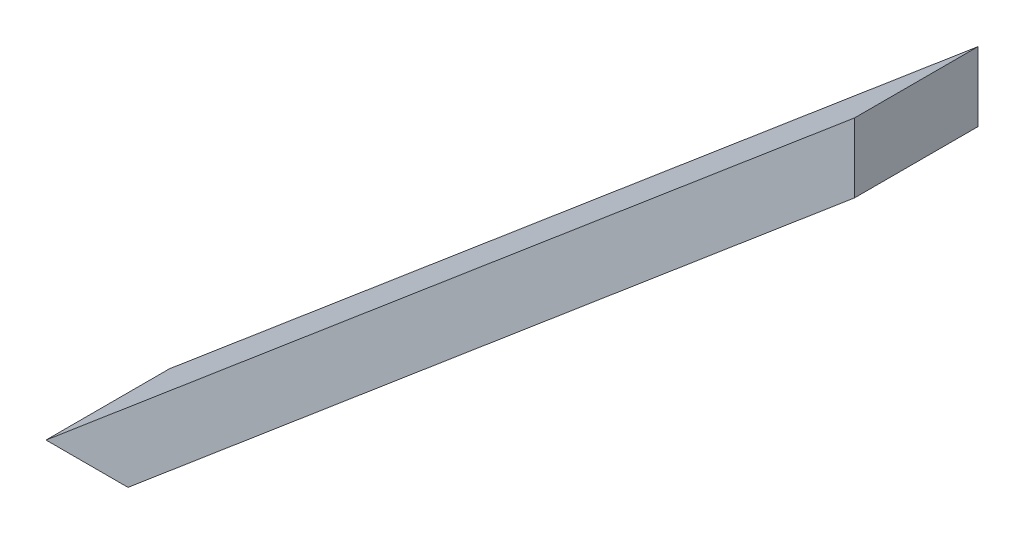
ISO-10303-21;
HEADER;
FILE_DESCRIPTION(('STEP AP214'),'2;1');
FILE_NAME('part.step','',(''),(''),'','','');
FILE_SCHEMA(('AUTOMOTIVE_DESIGN { 1 0 10303 214 1 1 1 1 }'));
ENDSEC;
DATA;
#1=APPLICATION_CONTEXT('core data for automotive mechanical design processes');
#2=APPLICATION_PROTOCOL_DEFINITION('international standard','automotive_design',2000,#1);
#3=PRODUCT_CONTEXT('',#1,'mechanical');
#4=PRODUCT('Part','Part','',(#3));
#5=PRODUCT_RELATED_PRODUCT_CATEGORY('part','',(#4));
#6=PRODUCT_DEFINITION_FORMATION('','',#4);
#7=PRODUCT_DEFINITION_CONTEXT('part definition',#1,'design');
#8=PRODUCT_DEFINITION('design','',#6,#7);
#9=PRODUCT_DEFINITION_SHAPE('','',#8);
#10=(LENGTH_UNIT() NAMED_UNIT(*) SI_UNIT(.MILLI.,.METRE.));
#11=(NAMED_UNIT(*) PLANE_ANGLE_UNIT() SI_UNIT($,.RADIAN.));
#12=(NAMED_UNIT(*) SI_UNIT($,.STERADIAN.) SOLID_ANGLE_UNIT());
#13=UNCERTAINTY_MEASURE_WITH_UNIT(LENGTH_MEASURE(1.E-05),#10,'distance_accuracy_value','');
#14=(GEOMETRIC_REPRESENTATION_CONTEXT(3) GLOBAL_UNCERTAINTY_ASSIGNED_CONTEXT((#13)) GLOBAL_UNIT_ASSIGNED_CONTEXT((#10,
#11,#12)) REPRESENTATION_CONTEXT('',''));
#15=CARTESIAN_POINT('',(0.,0.,0.));
#16=DIRECTION('',(0.,0.,1.));
#17=DIRECTION('',(1.,0.,0.));
#18=AXIS2_PLACEMENT_3D('',#15,#16,#17);
#19=CARTESIAN_POINT('',(-996.665165798843,-402.92894929732,44.45));
#20=DIRECTION('',(0.645444815350814,-0.763806906447404,0.));
#21=DIRECTION('',(0.763806906447405,0.645444815350814,0.));
#22=AXIS2_PLACEMENT_3D('',#19,#20,#21);
#23=PLANE('',#22);
#24=DIRECTION('',(-0.763806906447404,-0.645444815350814,0.));
#25=VECTOR('',#24,1.);
#26=CARTESIAN_POINT('',(-996.665165798843,-402.92894929732,-44.45));
#27=LINE('',#26,#25);
#28=CARTESIAN_POINT('',(-414.644303085921,88.9,-44.45));
#29=VERTEX_POINT('',#28);
#30=CARTESIAN_POINT('',(-996.665165798843,-402.92894929732,-44.45));
#31=VERTEX_POINT('',#30);
#32=EDGE_CURVE('E98',#29,#31,#27,.T.);
#33=ORIENTED_EDGE('',*,*,#32,.T.);
#34=DIRECTION('',(0.,0.,-1.));
#35=VECTOR('',#34,1.);
#36=CARTESIAN_POINT('',(-996.665165798843,-402.92894929732,44.45));
#37=LINE('',#36,#35);
#38=CARTESIAN_POINT('',(-996.665165798843,-402.92894929732,44.45));
#39=VERTEX_POINT('',#38);
#40=EDGE_CURVE('E11',#39,#31,#37,.T.);
#41=ORIENTED_EDGE('',*,*,#40,.F.);
#42=DIRECTION('',(-0.763806906447404,-0.645444815350814,0.));
#43=VECTOR('',#42,1.);
#44=CARTESIAN_POINT('',(-996.665165798843,-402.92894929732,44.45));
#45=LINE('',#44,#43);
#46=CARTESIAN_POINT('',(-414.644303085921,88.9,44.45));
#47=VERTEX_POINT('',#46);
#48=EDGE_CURVE('E86',#47,#39,#45,.T.);
#49=ORIENTED_EDGE('',*,*,#48,.F.);
#50=DIRECTION('',(0.,0.,-1.));
#51=VECTOR('',#50,1.);
#52=CARTESIAN_POINT('',(-414.644303085921,88.9,44.45));
#53=LINE('',#52,#51);
#54=EDGE_CURVE('E94',#47,#29,#53,.T.);
#55=ORIENTED_EDGE('',*,*,#54,.T.);
#56=EDGE_LOOP('',(#33,#41,#49,#55));
#57=FACE_BOUND('',#56,.T.);
#58=ADVANCED_FACE('F35',(#57),#23,.F.);
#59=CARTESIAN_POINT('',(-937.636106932995,-402.92894929732,44.45));
#60=DIRECTION('',(0.,1.,0.));
#61=DIRECTION('',(-1.,0.,0.));
#62=AXIS2_PLACEMENT_3D('',#59,#60,#61);
#63=PLANE('',#62);
#64=DIRECTION('',(1.,0.,0.));
#65=VECTOR('',#64,1.);
#66=CARTESIAN_POINT('',(-937.636106932995,-402.92894929732,-44.45));
#67=LINE('',#66,#65);
#68=CARTESIAN_POINT('',(-937.636106932995,-402.92894929732,-44.45));
#69=VERTEX_POINT('',#68);
#70=EDGE_CURVE('E90',#31,#69,#67,.T.);
#71=ORIENTED_EDGE('',*,*,#70,.T.);
#72=DIRECTION('',(0.,0.,-1.));
#73=VECTOR('',#72,1.);
#74=CARTESIAN_POINT('',(-937.636106932995,-402.92894929732,44.45));
#75=LINE('',#74,#73);
#76=CARTESIAN_POINT('',(-937.636106932995,-402.92894929732,44.45));
#77=VERTEX_POINT('',#76);
#78=EDGE_CURVE('E43',#77,#69,#75,.T.);
#79=ORIENTED_EDGE('',*,*,#78,.F.);
#80=DIRECTION('',(1.,0.,0.));
#81=VECTOR('',#80,1.);
#82=CARTESIAN_POINT('',(-937.636106932995,-402.92894929732,44.45));
#83=LINE('',#82,#81);
#84=EDGE_CURVE('E81',#39,#77,#83,.T.);
#85=ORIENTED_EDGE('',*,*,#84,.F.);
#86=ORIENTED_EDGE('',*,*,#40,.T.);
#87=EDGE_LOOP('',(#71,#79,#85,#86));
#88=FACE_BOUND('',#87,.T.);
#89=ADVANCED_FACE('F89',(#88),#63,.F.);
#90=CARTESIAN_POINT('',(-414.644303077947,39.0182829413487,44.45));
#91=DIRECTION('',(-0.645444815350814,0.763806906447404,0.));
#92=DIRECTION('',(-0.763806906447404,-0.645444815350814,0.));
#93=AXIS2_PLACEMENT_3D('',#90,#91,#92);
#94=PLANE('',#93);
#95=DIRECTION('',(0.763806906447404,0.645444815350814,0.));
#96=VECTOR('',#95,1.);
#97=CARTESIAN_POINT('',(-414.644303077947,39.0182829413487,-44.45));
#98=LINE('',#97,#96);
#99=CARTESIAN_POINT('',(-414.644303077947,39.0182829413487,-44.45));
#100=VERTEX_POINT('',#99);
#101=EDGE_CURVE('E68',#69,#100,#98,.T.);
#102=ORIENTED_EDGE('',*,*,#101,.T.);
#103=DIRECTION('',(0.,0.,-1.));
#104=VECTOR('',#103,1.);
#105=CARTESIAN_POINT('',(-414.644303077947,39.0182829413487,44.45));
#106=LINE('',#105,#104);
#107=CARTESIAN_POINT('',(-414.644303077947,39.0182829413487,44.45));
#108=VERTEX_POINT('',#107);
#109=EDGE_CURVE('E91',#108,#100,#106,.T.);
#110=ORIENTED_EDGE('',*,*,#109,.F.);
#111=DIRECTION('',(0.763806906447404,0.645444815350814,0.));
#112=VECTOR('',#111,1.);
#113=CARTESIAN_POINT('',(-414.644303077947,39.0182829413487,44.45));
#114=LINE('',#113,#112);
#115=EDGE_CURVE('E84',#77,#108,#114,.T.);
#116=ORIENTED_EDGE('',*,*,#115,.F.);
#117=ORIENTED_EDGE('',*,*,#78,.T.);
#118=EDGE_LOOP('',(#102,#110,#116,#117));
#119=FACE_BOUND('',#118,.T.);
#120=ADVANCED_FACE('F92',(#119),#94,.F.);
#121=CARTESIAN_POINT('',(-414.644303085921,88.9,44.45));
#122=DIRECTION('',(-1.,-1.59859490055079E-10,0.));
#123=DIRECTION('',(1.59859490055079E-10,-1.,0.));
#124=AXIS2_PLACEMENT_3D('',#121,#122,#123);
#125=PLANE('',#124);
#126=DIRECTION('',(-1.59859490055079E-10,1.,0.));
#127=VECTOR('',#126,1.);
#128=CARTESIAN_POINT('',(-414.644303085921,88.9,-44.45));
#129=LINE('',#128,#127);
#130=EDGE_CURVE('E74',#100,#29,#129,.T.);
#131=ORIENTED_EDGE('',*,*,#130,.T.);
#132=ORIENTED_EDGE('',*,*,#54,.F.);
#133=DIRECTION('',(-1.59859490055079E-10,1.,0.));
#134=VECTOR('',#133,1.);
#135=CARTESIAN_POINT('',(-414.644303085921,88.9,44.45));
#136=LINE('',#135,#134);
#137=EDGE_CURVE('E51',#108,#47,#136,.T.);
#138=ORIENTED_EDGE('',*,*,#137,.F.);
#139=ORIENTED_EDGE('',*,*,#109,.T.);
#140=EDGE_LOOP('',(#131,#132,#138,#139));
#141=FACE_BOUND('',#140,.T.);
#142=ADVANCED_FACE('F105',(#141),#125,.F.);
#143=CARTESIAN_POINT('',(0.,0.,44.45));
#144=DIRECTION('',(0.,0.,-1.));
#145=DIRECTION('',(-1.,0.,0.));
#146=AXIS2_PLACEMENT_3D('',#143,#144,#145);
#147=PLANE('',#146);
#148=ORIENTED_EDGE('',*,*,#48,.T.);
#149=ORIENTED_EDGE('',*,*,#84,.T.);
#150=ORIENTED_EDGE('',*,*,#115,.T.);
#151=ORIENTED_EDGE('',*,*,#137,.T.);
#152=EDGE_LOOP('',(#148,#149,#150,#151));
#153=FACE_BOUND('',#152,.T.);
#154=ADVANCED_FACE('F82',(#153),#147,.F.);
#155=CARTESIAN_POINT('',(0.,0.,-44.45));
#156=DIRECTION('',(0.,0.,-1.));
#157=DIRECTION('',(-1.,0.,0.));
#158=AXIS2_PLACEMENT_3D('',#155,#156,#157);
#159=PLANE('',#158);
#160=ORIENTED_EDGE('',*,*,#32,.F.);
#161=ORIENTED_EDGE('',*,*,#130,.F.);
#162=ORIENTED_EDGE('',*,*,#101,.F.);
#163=ORIENTED_EDGE('',*,*,#70,.F.);
#164=EDGE_LOOP('',(#160,#161,#162,#163));
#165=FACE_BOUND('',#164,.T.);
#166=ADVANCED_FACE('F108',(#165),#159,.T.);
#167=CLOSED_SHELL('',(#58,#89,#120,#142,#154,#166));
#168=MANIFOLD_SOLID_BREP('B2',#167);
#169=ADVANCED_BREP_SHAPE_REPRESENTATION('',(#18,#168),#14);
#170=SHAPE_DEFINITION_REPRESENTATION(#9,#169);
ENDSEC;
END-ISO-10303-21;
